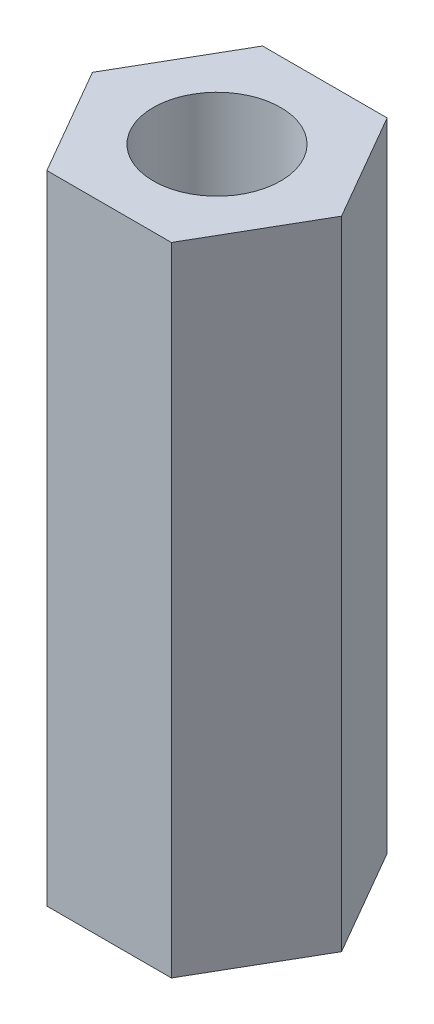
ISO-10303-21;
HEADER;
FILE_DESCRIPTION(('STEP AP214'),'2;1');
FILE_NAME('part.step','',(''),(''),'','','');
FILE_SCHEMA(('AUTOMOTIVE_DESIGN { 1 0 10303 214 1 1 1 1 }'));
ENDSEC;
DATA;
#1=APPLICATION_CONTEXT('core data for automotive mechanical design processes');
#2=APPLICATION_PROTOCOL_DEFINITION('international standard','automotive_design',2000,#1);
#3=PRODUCT_CONTEXT('',#1,'mechanical');
#4=PRODUCT('Part','Part','',(#3));
#5=PRODUCT_RELATED_PRODUCT_CATEGORY('part','',(#4));
#6=PRODUCT_DEFINITION_FORMATION('','',#4);
#7=PRODUCT_DEFINITION_CONTEXT('part definition',#1,'design');
#8=PRODUCT_DEFINITION('design','',#6,#7);
#9=PRODUCT_DEFINITION_SHAPE('','',#8);
#10=(LENGTH_UNIT() NAMED_UNIT(*) SI_UNIT(.MILLI.,.METRE.));
#11=(NAMED_UNIT(*) PLANE_ANGLE_UNIT() SI_UNIT($,.RADIAN.));
#12=(NAMED_UNIT(*) SI_UNIT($,.STERADIAN.) SOLID_ANGLE_UNIT());
#13=UNCERTAINTY_MEASURE_WITH_UNIT(LENGTH_MEASURE(1.E-05),#10,'distance_accuracy_value','');
#14=(GEOMETRIC_REPRESENTATION_CONTEXT(3) GLOBAL_UNCERTAINTY_ASSIGNED_CONTEXT((#13)) GLOBAL_UNIT_ASSIGNED_CONTEXT((#10,
#11,#12)) REPRESENTATION_CONTEXT('',''));
#15=CARTESIAN_POINT('',(0.,0.,0.));
#16=DIRECTION('',(0.,0.,1.));
#17=DIRECTION('',(1.,0.,0.));
#18=AXIS2_PLACEMENT_3D('',#15,#16,#17);
#19=CARTESIAN_POINT('',(0.,15.,0.));
#20=DIRECTION('',(0.,-1.,0.));
#21=DIRECTION('',(0.,0.,-1.));
#22=AXIS2_PLACEMENT_3D('',#19,#20,#21);
#23=PLANE('',#22);
#24=DIRECTION('',(0.5,0.,-0.866025403784439));
#25=VECTOR('',#24,1.);
#26=CARTESIAN_POINT('',(1.46646968374165,15.,2.54));
#27=LINE('',#26,#25);
#28=CARTESIAN_POINT('',(1.46646968374165,15.,2.54));
#29=VERTEX_POINT('',#28);
#30=CARTESIAN_POINT('',(2.9329393674833,15.,0.));
#31=VERTEX_POINT('',#30);
#32=EDGE_CURVE('E156',#29,#31,#27,.T.);
#33=ORIENTED_EDGE('',*,*,#32,.T.);
#34=DIRECTION('',(-0.5,0.,-0.866025403784439));
#35=VECTOR('',#34,1.);
#36=CARTESIAN_POINT('',(1.46646968374165,15.,-2.54));
#37=LINE('',#36,#35);
#38=CARTESIAN_POINT('',(1.46646968374165,15.,-2.54));
#39=VERTEX_POINT('',#38);
#40=EDGE_CURVE('E104',#31,#39,#37,.T.);
#41=ORIENTED_EDGE('',*,*,#40,.T.);
#42=DIRECTION('',(-1.,0.,0.));
#43=VECTOR('',#42,1.);
#44=CARTESIAN_POINT('',(1.46646968374165,15.,-2.54));
#45=LINE('',#44,#43);
#46=CARTESIAN_POINT('',(-1.46646968374165,15.,-2.54));
#47=VERTEX_POINT('',#46);
#48=EDGE_CURVE('E117',#39,#47,#45,.T.);
#49=ORIENTED_EDGE('',*,*,#48,.T.);
#50=DIRECTION('',(-0.5,0.,0.866025403784439));
#51=VECTOR('',#50,1.);
#52=CARTESIAN_POINT('',(-1.46646968374165,15.,-2.54));
#53=LINE('',#52,#51);
#54=CARTESIAN_POINT('',(-2.9329393674833,15.,0.));
#55=VERTEX_POINT('',#54);
#56=EDGE_CURVE('E111',#47,#55,#53,.T.);
#57=ORIENTED_EDGE('',*,*,#56,.T.);
#58=DIRECTION('',(0.5,0.,0.866025403784439));
#59=VECTOR('',#58,1.);
#60=CARTESIAN_POINT('',(-1.46646968374165,15.,2.54));
#61=LINE('',#60,#59);
#62=CARTESIAN_POINT('',(-1.46646968374165,15.,2.54));
#63=VERTEX_POINT('',#62);
#64=EDGE_CURVE('E115',#55,#63,#61,.T.);
#65=ORIENTED_EDGE('',*,*,#64,.T.);
#66=DIRECTION('',(1.,0.,0.));
#67=VECTOR('',#66,1.);
#68=CARTESIAN_POINT('',(1.46646968374165,15.,2.54));
#69=LINE('',#68,#67);
#70=EDGE_CURVE('E67',#63,#29,#69,.T.);
#71=ORIENTED_EDGE('',*,*,#70,.T.);
#72=EDGE_LOOP('',(#33,#41,#49,#57,#65,#71));
#73=FACE_BOUND('',#72,.T.);
#74=CARTESIAN_POINT('',(0.,15.,0.));
#75=DIRECTION('',(0.,1.,0.));
#76=DIRECTION('',(0.,0.,1.));
#77=AXIS2_PLACEMENT_3D('',#74,#75,#76);
#78=CIRCLE('',#77,1.5);
#79=CARTESIAN_POINT('',(0.,15.,1.5));
#80=VERTEX_POINT('',#79);
#81=EDGE_CURVE('E144',#80,#80,#78,.T.);
#82=ORIENTED_EDGE('',*,*,#81,.F.);
#83=EDGE_LOOP('',(#82));
#84=FACE_BOUND('',#83,.T.);
#85=ADVANCED_FACE('F49',(#73,#84),#23,.F.);
#86=CARTESIAN_POINT('',(0.,0.,0.));
#87=DIRECTION('',(0.,-1.,0.));
#88=DIRECTION('',(0.,0.,-1.));
#89=AXIS2_PLACEMENT_3D('',#86,#87,#88);
#90=PLANE('',#89);
#91=DIRECTION('',(0.5,0.,-0.866025403784439));
#92=VECTOR('',#91,1.);
#93=CARTESIAN_POINT('',(1.46646968374165,0.,2.54));
#94=LINE('',#93,#92);
#95=CARTESIAN_POINT('',(1.46646968374165,0.,2.54));
#96=VERTEX_POINT('',#95);
#97=CARTESIAN_POINT('',(2.9329393674833,0.,0.));
#98=VERTEX_POINT('',#97);
#99=EDGE_CURVE('E139',#96,#98,#94,.T.);
#100=ORIENTED_EDGE('',*,*,#99,.F.);
#101=DIRECTION('',(1.,0.,0.));
#102=VECTOR('',#101,1.);
#103=CARTESIAN_POINT('',(1.46646968374165,0.,2.54));
#104=LINE('',#103,#102);
#105=CARTESIAN_POINT('',(-1.46646968374165,0.,2.54));
#106=VERTEX_POINT('',#105);
#107=EDGE_CURVE('E96',#106,#96,#104,.T.);
#108=ORIENTED_EDGE('',*,*,#107,.F.);
#109=DIRECTION('',(0.5,0.,0.866025403784439));
#110=VECTOR('',#109,1.);
#111=CARTESIAN_POINT('',(-1.46646968374165,0.,2.54));
#112=LINE('',#111,#110);
#113=CARTESIAN_POINT('',(-2.9329393674833,0.,0.));
#114=VERTEX_POINT('',#113);
#115=EDGE_CURVE('E90',#114,#106,#112,.T.);
#116=ORIENTED_EDGE('',*,*,#115,.F.);
#117=DIRECTION('',(-0.5,0.,0.866025403784439));
#118=VECTOR('',#117,1.);
#119=CARTESIAN_POINT('',(-1.46646968374165,0.,-2.54));
#120=LINE('',#119,#118);
#121=CARTESIAN_POINT('',(-1.46646968374165,0.,-2.54));
#122=VERTEX_POINT('',#121);
#123=EDGE_CURVE('E126',#122,#114,#120,.T.);
#124=ORIENTED_EDGE('',*,*,#123,.F.);
#125=DIRECTION('',(-1.,0.,0.));
#126=VECTOR('',#125,1.);
#127=CARTESIAN_POINT('',(1.46646968374165,0.,-2.54));
#128=LINE('',#127,#126);
#129=CARTESIAN_POINT('',(1.46646968374165,0.,-2.54));
#130=VERTEX_POINT('',#129);
#131=EDGE_CURVE('E147',#130,#122,#128,.T.);
#132=ORIENTED_EDGE('',*,*,#131,.F.);
#133=DIRECTION('',(-0.5,0.,-0.866025403784439));
#134=VECTOR('',#133,1.);
#135=CARTESIAN_POINT('',(1.46646968374165,0.,-2.54));
#136=LINE('',#135,#134);
#137=EDGE_CURVE('E143',#98,#130,#136,.T.);
#138=ORIENTED_EDGE('',*,*,#137,.F.);
#139=EDGE_LOOP('',(#100,#108,#116,#124,#132,#138));
#140=FACE_BOUND('',#139,.T.);
#141=CARTESIAN_POINT('',(0.,0.,0.));
#142=DIRECTION('',(0.,1.,0.));
#143=DIRECTION('',(0.,0.,1.));
#144=AXIS2_PLACEMENT_3D('',#141,#142,#143);
#145=CIRCLE('',#144,1.5);
#146=CARTESIAN_POINT('',(0.,0.,1.5));
#147=VERTEX_POINT('',#146);
#148=EDGE_CURVE('E289',#147,#147,#145,.T.);
#149=ORIENTED_EDGE('',*,*,#148,.T.);
#150=EDGE_LOOP('',(#149));
#151=FACE_BOUND('',#150,.T.);
#152=ADVANCED_FACE('F169',(#140,#151),#90,.T.);
#153=CARTESIAN_POINT('',(1.46646968374165,15.,2.54));
#154=DIRECTION('',(-0.866025403784439,0.,-0.5));
#155=DIRECTION('',(-0.5,0.,0.866025403784439));
#156=AXIS2_PLACEMENT_3D('',#153,#154,#155);
#157=PLANE('',#156);
#158=ORIENTED_EDGE('',*,*,#99,.T.);
#159=DIRECTION('',(0.,-1.,0.));
#160=VECTOR('',#159,1.);
#161=CARTESIAN_POINT('',(2.9329393674833,15.,0.));
#162=LINE('',#161,#160);
#163=EDGE_CURVE('E11',#31,#98,#162,.T.);
#164=ORIENTED_EDGE('',*,*,#163,.F.);
#165=ORIENTED_EDGE('',*,*,#32,.F.);
#166=DIRECTION('',(0.,-1.,0.));
#167=VECTOR('',#166,1.);
#168=CARTESIAN_POINT('',(1.46646968374165,15.,2.54));
#169=LINE('',#168,#167);
#170=EDGE_CURVE('E135',#29,#96,#169,.T.);
#171=ORIENTED_EDGE('',*,*,#170,.T.);
#172=EDGE_LOOP('',(#158,#164,#165,#171));
#173=FACE_BOUND('',#172,.T.);
#174=ADVANCED_FACE('F51',(#173),#157,.F.);
#175=CARTESIAN_POINT('',(1.46646968374165,15.,-2.54));
#176=DIRECTION('',(-0.866025403784439,0.,0.5));
#177=DIRECTION('',(0.5,0.,0.866025403784439));
#178=AXIS2_PLACEMENT_3D('',#175,#176,#177);
#179=PLANE('',#178);
#180=ORIENTED_EDGE('',*,*,#137,.T.);
#181=DIRECTION('',(0.,-1.,0.));
#182=VECTOR('',#181,1.);
#183=CARTESIAN_POINT('',(1.46646968374165,15.,-2.54));
#184=LINE('',#183,#182);
#185=EDGE_CURVE('E59',#39,#130,#184,.T.);
#186=ORIENTED_EDGE('',*,*,#185,.F.);
#187=ORIENTED_EDGE('',*,*,#40,.F.);
#188=ORIENTED_EDGE('',*,*,#163,.T.);
#189=EDGE_LOOP('',(#180,#186,#187,#188));
#190=FACE_BOUND('',#189,.T.);
#191=ADVANCED_FACE('F194',(#190),#179,.F.);
#192=CARTESIAN_POINT('',(1.46646968374165,15.,-2.54));
#193=DIRECTION('',(0.,0.,1.));
#194=DIRECTION('',(1.,0.,0.));
#195=AXIS2_PLACEMENT_3D('',#192,#193,#194);
#196=PLANE('',#195);
#197=ORIENTED_EDGE('',*,*,#131,.T.);
#198=DIRECTION('',(0.,-1.,0.));
#199=VECTOR('',#198,1.);
#200=CARTESIAN_POINT('',(-1.46646968374165,15.,-2.54));
#201=LINE('',#200,#199);
#202=EDGE_CURVE('E128',#47,#122,#201,.T.);
#203=ORIENTED_EDGE('',*,*,#202,.F.);
#204=ORIENTED_EDGE('',*,*,#48,.F.);
#205=ORIENTED_EDGE('',*,*,#185,.T.);
#206=EDGE_LOOP('',(#197,#203,#204,#205));
#207=FACE_BOUND('',#206,.T.);
#208=ADVANCED_FACE('F166',(#207),#196,.F.);
#209=CARTESIAN_POINT('',(-1.46646968374165,15.,-2.54));
#210=DIRECTION('',(0.866025403784439,0.,0.5));
#211=DIRECTION('',(0.5,0.,-0.866025403784439));
#212=AXIS2_PLACEMENT_3D('',#209,#210,#211);
#213=PLANE('',#212);
#214=ORIENTED_EDGE('',*,*,#123,.T.);
#215=DIRECTION('',(0.,-1.,0.));
#216=VECTOR('',#215,1.);
#217=CARTESIAN_POINT('',(-2.9329393674833,15.,0.));
#218=LINE('',#217,#216);
#219=EDGE_CURVE('E123',#55,#114,#218,.T.);
#220=ORIENTED_EDGE('',*,*,#219,.F.);
#221=ORIENTED_EDGE('',*,*,#56,.F.);
#222=ORIENTED_EDGE('',*,*,#202,.T.);
#223=EDGE_LOOP('',(#214,#220,#221,#222));
#224=FACE_BOUND('',#223,.T.);
#225=ADVANCED_FACE('F124',(#224),#213,.F.);
#226=CARTESIAN_POINT('',(-1.46646968374165,15.,2.54));
#227=DIRECTION('',(0.866025403784439,0.,-0.5));
#228=DIRECTION('',(-0.5,0.,-0.866025403784439));
#229=AXIS2_PLACEMENT_3D('',#226,#227,#228);
#230=PLANE('',#229);
#231=ORIENTED_EDGE('',*,*,#115,.T.);
#232=DIRECTION('',(0.,-1.,0.));
#233=VECTOR('',#232,1.);
#234=CARTESIAN_POINT('',(-1.46646968374165,15.,2.54));
#235=LINE('',#234,#233);
#236=EDGE_CURVE('E129',#63,#106,#235,.T.);
#237=ORIENTED_EDGE('',*,*,#236,.F.);
#238=ORIENTED_EDGE('',*,*,#64,.F.);
#239=ORIENTED_EDGE('',*,*,#219,.T.);
#240=EDGE_LOOP('',(#231,#237,#238,#239));
#241=FACE_BOUND('',#240,.T.);
#242=ADVANCED_FACE('F131',(#241),#230,.F.);
#243=CARTESIAN_POINT('',(1.46646968374165,15.,2.54));
#244=DIRECTION('',(0.,0.,-1.));
#245=DIRECTION('',(-1.,0.,0.));
#246=AXIS2_PLACEMENT_3D('',#243,#244,#245);
#247=PLANE('',#246);
#248=ORIENTED_EDGE('',*,*,#107,.T.);
#249=ORIENTED_EDGE('',*,*,#170,.F.);
#250=ORIENTED_EDGE('',*,*,#70,.F.);
#251=ORIENTED_EDGE('',*,*,#236,.T.);
#252=EDGE_LOOP('',(#248,#249,#250,#251));
#253=FACE_BOUND('',#252,.T.);
#254=ADVANCED_FACE('F174',(#253),#247,.F.);
#255=CARTESIAN_POINT('',(0.,15.,0.));
#256=DIRECTION('',(0.,-1.,0.));
#257=DIRECTION('',(0.,0.,-1.));
#258=AXIS2_PLACEMENT_3D('',#255,#256,#257);
#259=CYLINDRICAL_SURFACE('',#258,1.5);
#260=ORIENTED_EDGE('',*,*,#81,.T.);
#261=EDGE_LOOP('',(#260));
#262=FACE_BOUND('',#261,.T.);
#263=ORIENTED_EDGE('',*,*,#148,.F.);
#264=EDGE_LOOP('',(#263));
#265=FACE_BOUND('',#264,.T.);
#266=ADVANCED_FACE('F176',(#262,#265),#259,.F.);
#267=CLOSED_SHELL('',(#85,#152,#174,#191,#208,#225,#242,#254,#266));
#268=MANIFOLD_SOLID_BREP('B2',#267);
#269=ADVANCED_BREP_SHAPE_REPRESENTATION('',(#18,#268),#14);
#270=SHAPE_DEFINITION_REPRESENTATION(#9,#269);
ENDSEC;
END-ISO-10303-21;
